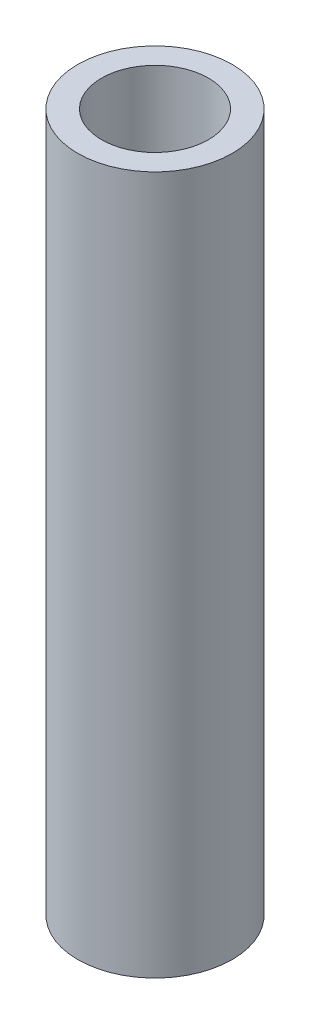
ISO-10303-21;
HEADER;
FILE_DESCRIPTION(('STEP AP214'),'2;1');
FILE_NAME('part.step','',(''),(''),'','','');
FILE_SCHEMA(('AUTOMOTIVE_DESIGN { 1 0 10303 214 1 1 1 1 }'));
ENDSEC;
DATA;
#1=APPLICATION_CONTEXT('core data for automotive mechanical design processes');
#2=APPLICATION_PROTOCOL_DEFINITION('international standard','automotive_design',2000,#1);
#3=PRODUCT_CONTEXT('',#1,'mechanical');
#4=PRODUCT('Part','Part','',(#3));
#5=PRODUCT_RELATED_PRODUCT_CATEGORY('part','',(#4));
#6=PRODUCT_DEFINITION_FORMATION('','',#4);
#7=PRODUCT_DEFINITION_CONTEXT('part definition',#1,'design');
#8=PRODUCT_DEFINITION('design','',#6,#7);
#9=PRODUCT_DEFINITION_SHAPE('','',#8);
#10=(LENGTH_UNIT() NAMED_UNIT(*) SI_UNIT(.MILLI.,.METRE.));
#11=(NAMED_UNIT(*) PLANE_ANGLE_UNIT() SI_UNIT($,.RADIAN.));
#12=(NAMED_UNIT(*) SI_UNIT($,.STERADIAN.) SOLID_ANGLE_UNIT());
#13=UNCERTAINTY_MEASURE_WITH_UNIT(LENGTH_MEASURE(1.E-05),#10,'distance_accuracy_value','');
#14=(GEOMETRIC_REPRESENTATION_CONTEXT(3) GLOBAL_UNCERTAINTY_ASSIGNED_CONTEXT((#13)) GLOBAL_UNIT_ASSIGNED_CONTEXT((#10,
#11,#12)) REPRESENTATION_CONTEXT('',''));
#15=CARTESIAN_POINT('',(0.,0.,0.));
#16=DIRECTION('',(0.,0.,1.));
#17=DIRECTION('',(1.,0.,0.));
#18=AXIS2_PLACEMENT_3D('',#15,#16,#17);
#19=CARTESIAN_POINT('',(0.,37.338,0.));
#20=DIRECTION('',(0.,1.,0.));
#21=DIRECTION('',(0.,0.,-1.));
#22=AXIS2_PLACEMENT_3D('',#19,#20,#21);
#23=PLANE('',#22);
#24=CARTESIAN_POINT('',(0.,37.338,0.));
#25=DIRECTION('',(0.,-1.,0.));
#26=DIRECTION('',(0.,0.,-1.));
#27=AXIS2_PLACEMENT_3D('',#24,#25,#26);
#28=CIRCLE('',#27,4.127000001);
#29=CARTESIAN_POINT('',(0.,37.338,-4.127000001));
#30=VERTEX_POINT('',#29);
#31=EDGE_CURVE('E10',#30,#30,#28,.T.);
#32=ORIENTED_EDGE('',*,*,#31,.F.);
#33=EDGE_LOOP('',(#32));
#34=FACE_BOUND('',#33,.T.);
#35=CARTESIAN_POINT('',(0.,37.338,0.));
#36=DIRECTION('',(0.,-1.,0.));
#37=DIRECTION('',(0.,0.,-1.));
#38=AXIS2_PLACEMENT_3D('',#35,#36,#37);
#39=CIRCLE('',#38,2.857000001);
#40=CARTESIAN_POINT('',(0.,37.338,-2.857000001));
#41=VERTEX_POINT('',#40);
#42=EDGE_CURVE('E50',#41,#41,#39,.T.);
#43=ORIENTED_EDGE('',*,*,#42,.T.);
#44=EDGE_LOOP('',(#43));
#45=FACE_BOUND('',#44,.T.);
#46=ADVANCED_FACE('F39',(#34,#45),#23,.T.);
#47=CARTESIAN_POINT('',(0.,0.,0.));
#48=DIRECTION('',(0.,1.,0.));
#49=DIRECTION('',(0.,0.,-1.));
#50=AXIS2_PLACEMENT_3D('',#47,#48,#49);
#51=PLANE('',#50);
#52=CARTESIAN_POINT('',(0.,0.,0.));
#53=DIRECTION('',(0.,-1.,0.));
#54=DIRECTION('',(0.,0.,-1.));
#55=AXIS2_PLACEMENT_3D('',#52,#53,#54);
#56=CIRCLE('',#55,4.127000001);
#57=CARTESIAN_POINT('',(0.,0.,-4.127000001));
#58=VERTEX_POINT('',#57);
#59=EDGE_CURVE('E43',#58,#58,#56,.T.);
#60=ORIENTED_EDGE('',*,*,#59,.T.);
#61=EDGE_LOOP('',(#60));
#62=FACE_BOUND('',#61,.T.);
#63=CARTESIAN_POINT('',(0.,0.,0.));
#64=DIRECTION('',(0.,-1.,0.));
#65=DIRECTION('',(0.,0.,-1.));
#66=AXIS2_PLACEMENT_3D('',#63,#64,#65);
#67=CIRCLE('',#66,2.857000001);
#68=CARTESIAN_POINT('',(0.,0.,-2.857000001));
#69=VERTEX_POINT('',#68);
#70=EDGE_CURVE('E52',#69,#69,#67,.T.);
#71=ORIENTED_EDGE('',*,*,#70,.F.);
#72=EDGE_LOOP('',(#71));
#73=FACE_BOUND('',#72,.T.);
#74=ADVANCED_FACE('F65',(#62,#73),#51,.F.);
#75=CARTESIAN_POINT('',(0.,37.338,0.));
#76=DIRECTION('',(0.,-1.,0.));
#77=DIRECTION('',(0.,0.,1.));
#78=AXIS2_PLACEMENT_3D('',#75,#76,#77);
#79=CYLINDRICAL_SURFACE('',#78,4.127000001);
#80=ORIENTED_EDGE('',*,*,#31,.T.);
#81=EDGE_LOOP('',(#80));
#82=FACE_BOUND('',#81,.T.);
#83=ORIENTED_EDGE('',*,*,#59,.F.);
#84=EDGE_LOOP('',(#83));
#85=FACE_BOUND('',#84,.T.);
#86=ADVANCED_FACE('F41',(#82,#85),#79,.T.);
#87=CARTESIAN_POINT('',(0.,37.338,0.));
#88=DIRECTION('',(0.,-1.,0.));
#89=DIRECTION('',(0.,0.,1.));
#90=AXIS2_PLACEMENT_3D('',#87,#88,#89);
#91=CYLINDRICAL_SURFACE('',#90,2.857000001);
#92=ORIENTED_EDGE('',*,*,#42,.F.);
#93=EDGE_LOOP('',(#92));
#94=FACE_BOUND('',#93,.T.);
#95=ORIENTED_EDGE('',*,*,#70,.T.);
#96=EDGE_LOOP('',(#95));
#97=FACE_BOUND('',#96,.T.);
#98=ADVANCED_FACE('F59',(#94,#97),#91,.F.);
#99=CLOSED_SHELL('',(#46,#74,#86,#98));
#100=MANIFOLD_SOLID_BREP('B2',#99);
#101=ADVANCED_BREP_SHAPE_REPRESENTATION('',(#18,#100),#14);
#102=SHAPE_DEFINITION_REPRESENTATION(#9,#101);
ENDSEC;
END-ISO-10303-21;
